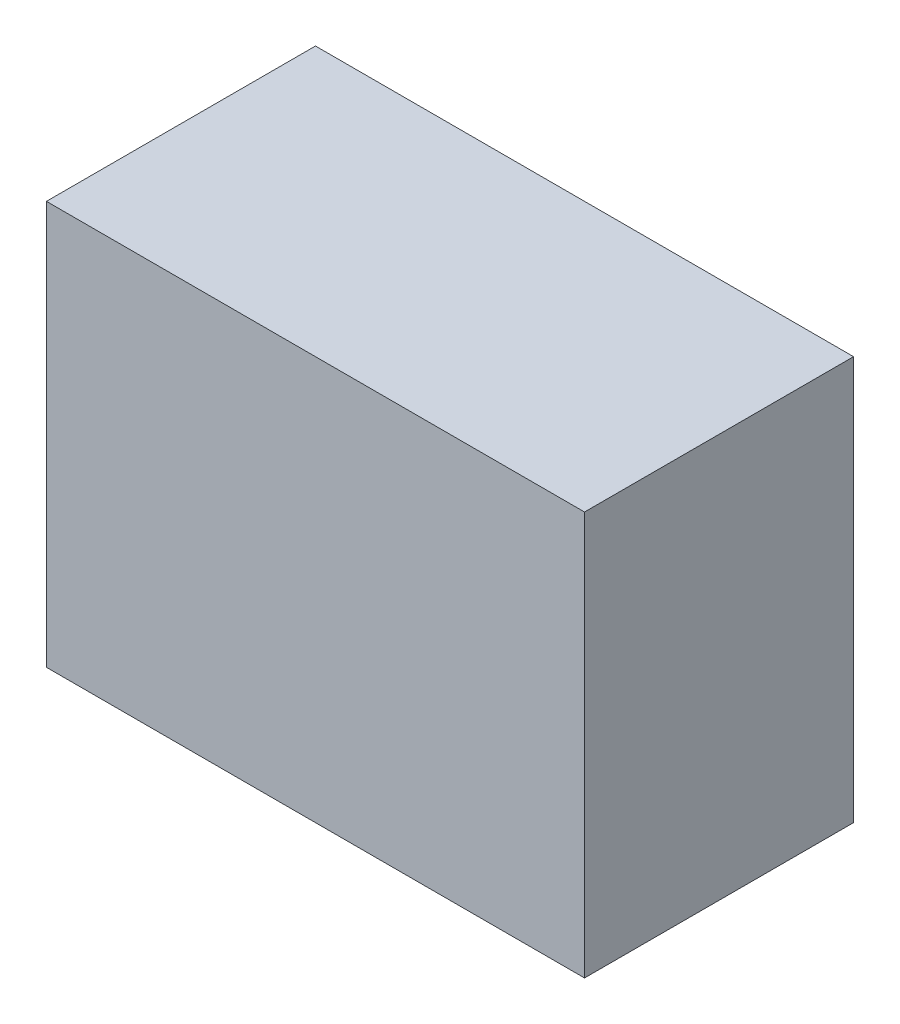
ISO-10303-21;
HEADER;
FILE_DESCRIPTION(('STEP AP214'),'2;1');
FILE_NAME('part.step','',(''),(''),'','','');
FILE_SCHEMA(('AUTOMOTIVE_DESIGN { 1 0 10303 214 1 1 1 1 }'));
ENDSEC;
DATA;
#1=APPLICATION_CONTEXT('core data for automotive mechanical design processes');
#2=APPLICATION_PROTOCOL_DEFINITION('international standard','automotive_design',2000,#1);
#3=PRODUCT_CONTEXT('',#1,'mechanical');
#4=PRODUCT('Part','Part','',(#3));
#5=PRODUCT_RELATED_PRODUCT_CATEGORY('part','',(#4));
#6=PRODUCT_DEFINITION_FORMATION('','',#4);
#7=PRODUCT_DEFINITION_CONTEXT('part definition',#1,'design');
#8=PRODUCT_DEFINITION('design','',#6,#7);
#9=PRODUCT_DEFINITION_SHAPE('','',#8);
#10=(LENGTH_UNIT() NAMED_UNIT(*) SI_UNIT(.MILLI.,.METRE.));
#11=(NAMED_UNIT(*) PLANE_ANGLE_UNIT() SI_UNIT($,.RADIAN.));
#12=(NAMED_UNIT(*) SI_UNIT($,.STERADIAN.) SOLID_ANGLE_UNIT());
#13=UNCERTAINTY_MEASURE_WITH_UNIT(LENGTH_MEASURE(1.E-05),#10,'distance_accuracy_value','');
#14=(GEOMETRIC_REPRESENTATION_CONTEXT(3) GLOBAL_UNCERTAINTY_ASSIGNED_CONTEXT((#13)) GLOBAL_UNIT_ASSIGNED_CONTEXT((#10,
#11,#12)) REPRESENTATION_CONTEXT('',''));
#15=CARTESIAN_POINT('',(0.,0.,0.));
#16=DIRECTION('',(0.,0.,1.));
#17=DIRECTION('',(1.,0.,0.));
#18=AXIS2_PLACEMENT_3D('',#15,#16,#17);
#19=CARTESIAN_POINT('',(-4.,6.,2.));
#20=DIRECTION('',(1.,0.,0.));
#21=DIRECTION('',(0.,0.,-1.));
#22=AXIS2_PLACEMENT_3D('',#19,#20,#21);
#23=PLANE('',#22);
#24=DIRECTION('',(0.,0.,1.));
#25=VECTOR('',#24,1.);
#26=CARTESIAN_POINT('',(-4.,0.,2.));
#27=LINE('',#26,#25);
#28=CARTESIAN_POINT('',(-4.,0.,-2.));
#29=VERTEX_POINT('',#28);
#30=CARTESIAN_POINT('',(-4.,0.,2.));
#31=VERTEX_POINT('',#30);
#32=EDGE_CURVE('E96',#29,#31,#27,.T.);
#33=ORIENTED_EDGE('',*,*,#32,.T.);
#34=DIRECTION('',(0.,-1.,0.));
#35=VECTOR('',#34,1.);
#36=CARTESIAN_POINT('',(-4.,6.,2.));
#37=LINE('',#36,#35);
#38=CARTESIAN_POINT('',(-4.,6.,2.));
#39=VERTEX_POINT('',#38);
#40=EDGE_CURVE('E11',#39,#31,#37,.T.);
#41=ORIENTED_EDGE('',*,*,#40,.F.);
#42=DIRECTION('',(0.,0.,1.));
#43=VECTOR('',#42,1.);
#44=CARTESIAN_POINT('',(-4.,6.,2.));
#45=LINE('',#44,#43);
#46=CARTESIAN_POINT('',(-4.,6.,-2.));
#47=VERTEX_POINT('',#46);
#48=EDGE_CURVE('E84',#47,#39,#45,.T.);
#49=ORIENTED_EDGE('',*,*,#48,.F.);
#50=DIRECTION('',(0.,-1.,0.));
#51=VECTOR('',#50,1.);
#52=CARTESIAN_POINT('',(-4.,6.,-2.));
#53=LINE('',#52,#51);
#54=EDGE_CURVE('E92',#47,#29,#53,.T.);
#55=ORIENTED_EDGE('',*,*,#54,.T.);
#56=EDGE_LOOP('',(#33,#41,#49,#55));
#57=FACE_BOUND('',#56,.T.);
#58=ADVANCED_FACE('F33',(#57),#23,.F.);
#59=CARTESIAN_POINT('',(4.,6.,2.));
#60=DIRECTION('',(0.,0.,-1.));
#61=DIRECTION('',(-1.,0.,0.));
#62=AXIS2_PLACEMENT_3D('',#59,#60,#61);
#63=PLANE('',#62);
#64=DIRECTION('',(1.,0.,0.));
#65=VECTOR('',#64,1.);
#66=CARTESIAN_POINT('',(4.,0.,2.));
#67=LINE('',#66,#65);
#68=CARTESIAN_POINT('',(4.,0.,2.));
#69=VERTEX_POINT('',#68);
#70=EDGE_CURVE('E88',#31,#69,#67,.T.);
#71=ORIENTED_EDGE('',*,*,#70,.T.);
#72=DIRECTION('',(0.,-1.,0.));
#73=VECTOR('',#72,1.);
#74=CARTESIAN_POINT('',(4.,6.,2.));
#75=LINE('',#74,#73);
#76=CARTESIAN_POINT('',(4.,6.,2.));
#77=VERTEX_POINT('',#76);
#78=EDGE_CURVE('E41',#77,#69,#75,.T.);
#79=ORIENTED_EDGE('',*,*,#78,.F.);
#80=DIRECTION('',(1.,0.,0.));
#81=VECTOR('',#80,1.);
#82=CARTESIAN_POINT('',(4.,6.,2.));
#83=LINE('',#82,#81);
#84=EDGE_CURVE('E79',#39,#77,#83,.T.);
#85=ORIENTED_EDGE('',*,*,#84,.F.);
#86=ORIENTED_EDGE('',*,*,#40,.T.);
#87=EDGE_LOOP('',(#71,#79,#85,#86));
#88=FACE_BOUND('',#87,.T.);
#89=ADVANCED_FACE('F87',(#88),#63,.F.);
#90=CARTESIAN_POINT('',(4.,6.,2.));
#91=DIRECTION('',(-1.,0.,0.));
#92=DIRECTION('',(0.,0.,1.));
#93=AXIS2_PLACEMENT_3D('',#90,#91,#92);
#94=PLANE('',#93);
#95=DIRECTION('',(0.,0.,-1.));
#96=VECTOR('',#95,1.);
#97=CARTESIAN_POINT('',(4.,0.,2.));
#98=LINE('',#97,#96);
#99=CARTESIAN_POINT('',(4.,0.,-2.));
#100=VERTEX_POINT('',#99);
#101=EDGE_CURVE('E66',#69,#100,#98,.T.);
#102=ORIENTED_EDGE('',*,*,#101,.T.);
#103=DIRECTION('',(0.,-1.,0.));
#104=VECTOR('',#103,1.);
#105=CARTESIAN_POINT('',(4.,6.,-2.));
#106=LINE('',#105,#104);
#107=CARTESIAN_POINT('',(4.,6.,-2.));
#108=VERTEX_POINT('',#107);
#109=EDGE_CURVE('E89',#108,#100,#106,.T.);
#110=ORIENTED_EDGE('',*,*,#109,.F.);
#111=DIRECTION('',(0.,0.,-1.));
#112=VECTOR('',#111,1.);
#113=CARTESIAN_POINT('',(4.,6.,2.));
#114=LINE('',#113,#112);
#115=EDGE_CURVE('E82',#77,#108,#114,.T.);
#116=ORIENTED_EDGE('',*,*,#115,.F.);
#117=ORIENTED_EDGE('',*,*,#78,.T.);
#118=EDGE_LOOP('',(#102,#110,#116,#117));
#119=FACE_BOUND('',#118,.T.);
#120=ADVANCED_FACE('F90',(#119),#94,.F.);
#121=CARTESIAN_POINT('',(4.,6.,-2.));
#122=DIRECTION('',(0.,0.,1.));
#123=DIRECTION('',(1.,0.,0.));
#124=AXIS2_PLACEMENT_3D('',#121,#122,#123);
#125=PLANE('',#124);
#126=DIRECTION('',(-1.,0.,0.));
#127=VECTOR('',#126,1.);
#128=CARTESIAN_POINT('',(4.,0.,-2.));
#129=LINE('',#128,#127);
#130=EDGE_CURVE('E72',#100,#29,#129,.T.);
#131=ORIENTED_EDGE('',*,*,#130,.T.);
#132=ORIENTED_EDGE('',*,*,#54,.F.);
#133=DIRECTION('',(-1.,0.,0.));
#134=VECTOR('',#133,1.);
#135=CARTESIAN_POINT('',(4.,6.,-2.));
#136=LINE('',#135,#134);
#137=EDGE_CURVE('E49',#108,#47,#136,.T.);
#138=ORIENTED_EDGE('',*,*,#137,.F.);
#139=ORIENTED_EDGE('',*,*,#109,.T.);
#140=EDGE_LOOP('',(#131,#132,#138,#139));
#141=FACE_BOUND('',#140,.T.);
#142=ADVANCED_FACE('F103',(#141),#125,.F.);
#143=CARTESIAN_POINT('',(0.,6.,0.));
#144=DIRECTION('',(0.,1.,0.));
#145=DIRECTION('',(0.,0.,1.));
#146=AXIS2_PLACEMENT_3D('',#143,#144,#145);
#147=PLANE('',#146);
#148=ORIENTED_EDGE('',*,*,#48,.T.);
#149=ORIENTED_EDGE('',*,*,#84,.T.);
#150=ORIENTED_EDGE('',*,*,#115,.T.);
#151=ORIENTED_EDGE('',*,*,#137,.T.);
#152=EDGE_LOOP('',(#148,#149,#150,#151));
#153=FACE_BOUND('',#152,.T.);
#154=ADVANCED_FACE('F80',(#153),#147,.T.);
#155=CARTESIAN_POINT('',(0.,0.,0.));
#156=DIRECTION('',(0.,1.,0.));
#157=DIRECTION('',(0.,0.,1.));
#158=AXIS2_PLACEMENT_3D('',#155,#156,#157);
#159=PLANE('',#158);
#160=ORIENTED_EDGE('',*,*,#32,.F.);
#161=ORIENTED_EDGE('',*,*,#130,.F.);
#162=ORIENTED_EDGE('',*,*,#101,.F.);
#163=ORIENTED_EDGE('',*,*,#70,.F.);
#164=EDGE_LOOP('',(#160,#161,#162,#163));
#165=FACE_BOUND('',#164,.T.);
#166=ADVANCED_FACE('F106',(#165),#159,.F.);
#167=CLOSED_SHELL('',(#58,#89,#120,#142,#154,#166));
#168=MANIFOLD_SOLID_BREP('B2',#167);
#169=ADVANCED_BREP_SHAPE_REPRESENTATION('',(#18,#168),#14);
#170=SHAPE_DEFINITION_REPRESENTATION(#9,#169);
ENDSEC;
END-ISO-10303-21;
